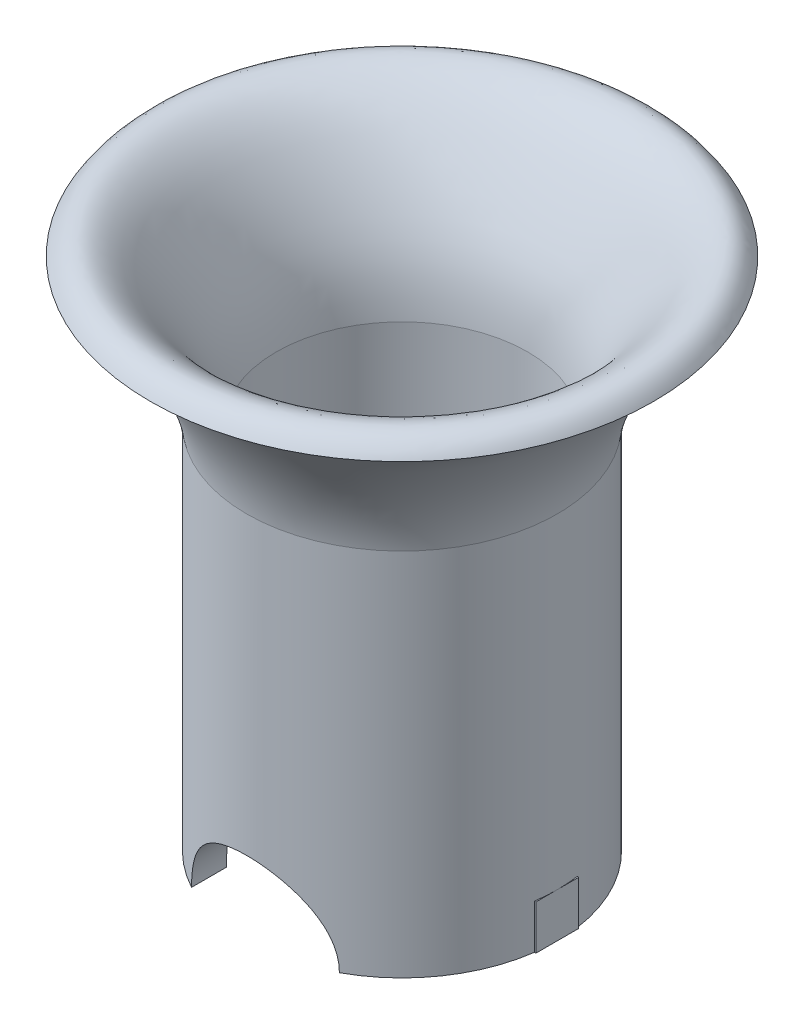
ISO-10303-21;
HEADER;
FILE_DESCRIPTION(('STEP AP214'),'2;1');
FILE_NAME('part.step','',(''),(''),'','','');
FILE_SCHEMA(('AUTOMOTIVE_DESIGN { 1 0 10303 214 1 1 1 1 }'));
ENDSEC;
DATA;
#1=APPLICATION_CONTEXT('core data for automotive mechanical design processes');
#2=APPLICATION_PROTOCOL_DEFINITION('international standard','automotive_design',2000,#1);
#3=PRODUCT_CONTEXT('',#1,'mechanical');
#4=PRODUCT('Part','Part','',(#3));
#5=PRODUCT_RELATED_PRODUCT_CATEGORY('part','',(#4));
#6=PRODUCT_DEFINITION_FORMATION('','',#4);
#7=PRODUCT_DEFINITION_CONTEXT('part definition',#1,'design');
#8=PRODUCT_DEFINITION('design','',#6,#7);
#9=PRODUCT_DEFINITION_SHAPE('','',#8);
#10=(LENGTH_UNIT() NAMED_UNIT(*) SI_UNIT(.MILLI.,.METRE.));
#11=(NAMED_UNIT(*) PLANE_ANGLE_UNIT() SI_UNIT($,.RADIAN.));
#12=(NAMED_UNIT(*) SI_UNIT($,.STERADIAN.) SOLID_ANGLE_UNIT());
#13=UNCERTAINTY_MEASURE_WITH_UNIT(LENGTH_MEASURE(1.E-05),#10,'distance_accuracy_value','');
#14=(GEOMETRIC_REPRESENTATION_CONTEXT(3) GLOBAL_UNCERTAINTY_ASSIGNED_CONTEXT((#13)) GLOBAL_UNIT_ASSIGNED_CONTEXT((#10,
#11,#12)) REPRESENTATION_CONTEXT('',''));
#15=CARTESIAN_POINT('',(0.,0.,0.));
#16=DIRECTION('',(0.,0.,1.));
#17=DIRECTION('',(1.,0.,0.));
#18=AXIS2_PLACEMENT_3D('',#15,#16,#17);
#19=CARTESIAN_POINT('',(-8.5,0.,0.));
#20=DIRECTION('',(0.,1.,0.));
#21=DIRECTION('',(0.,0.,1.));
#22=AXIS2_PLACEMENT_3D('',#19,#20,#21);
#23=PLANE('',#22);
#24=DIRECTION('',(0.,0.,-1.));
#25=VECTOR('',#24,1.);
#26=CARTESIAN_POINT('',(5.,0.,21.45));
#27=LINE('',#26,#25);
#28=CARTESIAN_POINT('',(5.,0.,6.87386354243376));
#29=VERTEX_POINT('',#28);
#30=CARTESIAN_POINT('',(5.,0.,9.23309265630969));
#31=VERTEX_POINT('',#30);
#32=EDGE_CURVE('E142',#29,#31,#27,.F.);
#33=ORIENTED_EDGE('',*,*,#32,.F.);
#34=CARTESIAN_POINT('',(0.,0.,0.));
#35=DIRECTION('',(0.,-1.,0.));
#36=DIRECTION('',(0.,0.,-1.));
#37=AXIS2_PLACEMENT_3D('',#34,#35,#36);
#38=CIRCLE('',#37,8.5);
#39=CARTESIAN_POINT('',(8.37541043770394,0.,1.45));
#40=VERTEX_POINT('',#39);
#41=EDGE_CURVE('E188',#40,#29,#38,.T.);
#42=ORIENTED_EDGE('',*,*,#41,.F.);
#43=DIRECTION('',(1.,0.,0.));
#44=VECTOR('',#43,1.);
#45=CARTESIAN_POINT('',(-2.5,0.,1.45));
#46=LINE('',#45,#44);
#47=CARTESIAN_POINT('',(-2.5,0.,1.45));
#48=VERTEX_POINT('',#47);
#49=EDGE_CURVE('E301',#48,#40,#46,.T.);
#50=ORIENTED_EDGE('',*,*,#49,.F.);
#51=DIRECTION('',(0.,0.,1.));
#52=VECTOR('',#51,1.);
#53=CARTESIAN_POINT('',(-2.5,0.,-1.45));
#54=LINE('',#53,#52);
#55=CARTESIAN_POINT('',(-2.5,0.,-1.45));
#56=VERTEX_POINT('',#55);
#57=EDGE_CURVE('E325',#56,#48,#54,.T.);
#58=ORIENTED_EDGE('',*,*,#57,.F.);
#59=DIRECTION('',(1.,0.,0.));
#60=VECTOR('',#59,1.);
#61=CARTESIAN_POINT('',(-2.5,0.,-1.45));
#62=LINE('',#61,#60);
#63=CARTESIAN_POINT('',(8.37541043770394,0.,-1.45));
#64=VERTEX_POINT('',#63);
#65=EDGE_CURVE('E314',#56,#64,#62,.T.);
#66=ORIENTED_EDGE('',*,*,#65,.T.);
#67=CARTESIAN_POINT('',(-5.,0.,6.87386354243376));
#68=VERTEX_POINT('',#67);
#69=EDGE_CURVE('E154',#68,#64,#38,.T.);
#70=ORIENTED_EDGE('',*,*,#69,.F.);
#71=DIRECTION('',(0.,0.,-1.));
#72=VECTOR('',#71,1.);
#73=CARTESIAN_POINT('',(-5.,0.,21.45));
#74=LINE('',#73,#72);
#75=CARTESIAN_POINT('',(-5.,0.,9.23309265630969));
#76=VERTEX_POINT('',#75);
#77=EDGE_CURVE('E139',#76,#68,#74,.T.);
#78=ORIENTED_EDGE('',*,*,#77,.F.);
#79=CARTESIAN_POINT('',(0.,0.,0.));
#80=DIRECTION('',(0.,-1.,0.));
#81=DIRECTION('',(0.,0.,-1.));
#82=AXIS2_PLACEMENT_3D('',#79,#80,#81);
#83=CIRCLE('',#82,10.5);
#84=CARTESIAN_POINT('',(10.3993990210973,0.,-1.45));
#85=VERTEX_POINT('',#84);
#86=EDGE_CURVE('E151',#76,#85,#83,.T.);
#87=ORIENTED_EDGE('',*,*,#86,.T.);
#88=CARTESIAN_POINT('',(10.5,0.,-1.45));
#89=VERTEX_POINT('',#88);
#90=EDGE_CURVE('E313',#85,#89,#62,.T.);
#91=ORIENTED_EDGE('',*,*,#90,.T.);
#92=DIRECTION('',(0.,0.,1.));
#93=VECTOR('',#92,1.);
#94=CARTESIAN_POINT('',(10.5,0.,-1.45));
#95=LINE('',#94,#93);
#96=CARTESIAN_POINT('',(10.5,0.,1.45));
#97=VERTEX_POINT('',#96);
#98=EDGE_CURVE('E331',#89,#97,#95,.T.);
#99=ORIENTED_EDGE('',*,*,#98,.T.);
#100=CARTESIAN_POINT('',(10.3993990210973,0.,1.45));
#101=VERTEX_POINT('',#100);
#102=EDGE_CURVE('E300',#101,#97,#46,.T.);
#103=ORIENTED_EDGE('',*,*,#102,.F.);
#104=EDGE_CURVE('E162',#101,#31,#83,.T.);
#105=ORIENTED_EDGE('',*,*,#104,.T.);
#106=EDGE_LOOP('',(#33,#42,#50,#58,#66,#70,#78,#87,#91,#99,#103,#105));
#107=FACE_BOUND('',#106,.T.);
#108=ADVANCED_FACE('F39',(#107),#23,.F.);
#109=CARTESIAN_POINT('',(0.,0.,0.));
#110=DIRECTION('',(0.,-1.,0.));
#111=DIRECTION('',(0.,0.,-1.));
#112=AXIS2_PLACEMENT_3D('',#109,#110,#111);
#113=CYLINDRICAL_SURFACE('',#112,8.5);
#114=CARTESIAN_POINT('',(0.,25.,0.));
#115=DIRECTION('',(0.,-1.,0.));
#116=DIRECTION('',(0.,0.,-1.));
#117=AXIS2_PLACEMENT_3D('',#114,#115,#116);
#118=CIRCLE('',#117,8.5);
#119=CARTESIAN_POINT('',(0.,25.,-8.5));
#120=VERTEX_POINT('',#119);
#121=EDGE_CURVE('E184',#120,#120,#118,.T.);
#122=ORIENTED_EDGE('',*,*,#121,.F.);
#123=EDGE_LOOP('',(#122));
#124=FACE_BOUND('',#123,.T.);
#125=CARTESIAN_POINT('',(-5.,0.,6.87386354243376));
#126=CARTESIAN_POINT('',(-5.00002762698772,0.127031840419532,6.87381207130144));
#127=CARTESIAN_POINT('',(-4.9951599952604,0.254033711125095,6.8773835892129));
#128=CARTESIAN_POINT('',(-4.97585356263384,0.506813697105629,6.89138136695817));
#129=CARTESIAN_POINT('',(-4.96142359531705,0.63259283321937,6.90180130022703));
#130=CARTESIAN_POINT('',(-4.92335834951799,0.881040729995309,6.92900078994346));
#131=CARTESIAN_POINT('',(-4.89979486908131,1.00372599076457,6.94573071689425));
#132=CARTESIAN_POINT('',(-4.84382795850321,1.24612160418095,6.98487638549004));
#133=CARTESIAN_POINT('',(-4.81142286355825,1.36583139193455,7.00729319787308));
#134=CARTESIAN_POINT('',(-4.70180131920097,1.71856070764222,7.08172813496281));
#135=CARTESIAN_POINT('',(-4.61200880508139,1.94625723085768,7.14106026135584));
#136=CARTESIAN_POINT('',(-4.40203778283476,2.38351932826443,7.27236972205275));
#137=CARTESIAN_POINT('',(-4.28179310605111,2.59304406919235,7.34437448709132));
#138=CARTESIAN_POINT('',(-3.99812131766827,3.01443243766363,7.50295977222075));
#139=CARTESIAN_POINT('',(-3.83130059471623,3.22374054574115,7.59026183860618));
#140=CARTESIAN_POINT('',(-3.46608288438449,3.6135245744319,7.76383189274972));
#141=CARTESIAN_POINT('',(-3.2676749270272,3.79399043458506,7.85009951001876));
#142=CARTESIAN_POINT('',(-2.93782398019796,4.04860047796028,7.9771584663809));
#143=CARTESIAN_POINT('',(-2.81620530774108,4.13415487726332,8.02100795967493));
#144=CARTESIAN_POINT('',(-2.56489327344668,4.29459224648281,8.10486498056056));
#145=CARTESIAN_POINT('',(-2.43520326535704,4.36947960671657,8.14487408654656));
#146=CARTESIAN_POINT('',(-2.16852325870026,4.50777797088069,8.21989606504622));
#147=CARTESIAN_POINT('',(-2.03153601661814,4.57119326907294,8.2549108060253));
#148=CARTESIAN_POINT('',(-1.75116652935802,4.68575879153627,8.31889869732371));
#149=CARTESIAN_POINT('',(-1.60778529011043,4.73691093708068,8.3478727939405));
#150=CARTESIAN_POINT('',(-1.32932398805587,4.82204233983721,8.39648672675625));
#151=CARTESIAN_POINT('',(-1.194702782298,4.85717238065777,8.41674205283343));
#152=CARTESIAN_POINT('',(-0.922236852218511,4.91618766519531,8.45093610945984));
#153=CARTESIAN_POINT('',(-0.784392591737924,4.94007451663044,8.46487574310987));
#154=CARTESIAN_POINT('',(-0.506771875309782,4.97621986867365,8.48602082180676));
#155=CARTESIAN_POINT('',(-0.366996835636269,4.98848647665224,8.4932309619269));
#156=CARTESIAN_POINT('',(-0.0867300957805486,5.00121481381228,8.50071301447176));
#157=CARTESIAN_POINT('',(0.0537615343354697,5.00167767580954,8.50098559270035));
#158=CARTESIAN_POINT('',(0.317330694271323,4.99144848591476,8.49497184462461));
#159=CARTESIAN_POINT('',(0.44048034758574,4.98208461452584,8.48946646039106));
#160=CARTESIAN_POINT('',(0.685445412854965,4.95432777543373,8.47320700764635));
#161=CARTESIAN_POINT('',(0.807260406901796,4.93593205787501,8.46245134062844));
#162=CARTESIAN_POINT('',(1.04863516110113,4.8903414803164,8.43594064350735));
#163=CARTESIAN_POINT('',(1.16819568735808,4.86314966855125,8.42018734534027));
#164=CARTESIAN_POINT('',(1.40436347908098,4.80028343532267,8.38403650938651));
#165=CARTESIAN_POINT('',(1.52096958682371,4.76460574376092,8.36363718134579));
#166=CARTESIAN_POINT('',(1.86685104764497,4.64484152886093,8.29579054863617));
#167=CARTESIAN_POINT('',(2.09069536138023,4.54831031972472,8.24186610553549));
#168=CARTESIAN_POINT('',(2.51920137812113,4.32574467934457,8.12116699229164));
#169=CARTESIAN_POINT('',(2.7238581612531,4.19970271006483,8.0543890397086));
#170=CARTESIAN_POINT('',(3.13393497702351,3.9050511792378,7.90452162421045));
#171=CARTESIAN_POINT('',(3.33665303215182,3.73318945542639,7.82043799066376));
#172=CARTESIAN_POINT('',(3.71218892088695,3.36003458563801,7.649333411729));
#173=CARTESIAN_POINT('',(3.88496063718,3.1586969109351,7.56230817826853));
#174=CARTESIAN_POINT('',(4.12779961844385,2.82541232897448,7.43108493226643));
#175=CARTESIAN_POINT('',(4.20937654569128,2.70241489674677,7.38504888630897));
#176=CARTESIAN_POINT('',(4.36180458071138,2.44878439018102,7.29605645681489));
#177=CARTESIAN_POINT('',(4.43265285856894,2.31814931379903,7.25310088738855));
#178=CARTESIAN_POINT('',(4.56272457618434,2.05028117844991,7.17198784064126));
#179=CARTESIAN_POINT('',(4.62198081507813,1.91306814444188,7.13381693873717));
#180=CARTESIAN_POINT('',(4.72834559703922,1.6325483082685,7.0637672215));
#181=CARTESIAN_POINT('',(4.77546405746663,1.48924659320664,7.03188327434154));
#182=CARTESIAN_POINT('',(4.84618085274268,1.2357328554754,6.98325557983875));
#183=CARTESIAN_POINT('',(4.87270755197598,1.12667022442722,6.9647330783794));
#184=CARTESIAN_POINT('',(4.91845452427515,0.906343597270457,6.93250208613364));
#185=CARTESIAN_POINT('',(4.93767709434214,0.795080304824734,6.91879208201755));
#186=CARTESIAN_POINT('',(4.96866979445923,0.570310338517283,6.89657224912268));
#187=CARTESIAN_POINT('',(4.98039431293872,0.45679418570295,6.88809425803927));
#188=CARTESIAN_POINT('',(4.99607204101878,0.228858189874719,6.87672026901672));
#189=CARTESIAN_POINT('',(5.00001892021662,0.114437686768705,6.8738288181308));
#190=CARTESIAN_POINT('',(5.,0.,6.87386354243376));
#191=B_SPLINE_CURVE_WITH_KNOTS('',3,(#125,#126,#127,#128,#129,#130,#131,#132,#133,#134,#135,
#136,#137,#138,#139,#140,#141,#142,#143,#144,#145,#146,#147,#148,#149,#150,#151,#152,#153,#154,
#155,#156,#157,#158,#159,#160,#161,#162,#163,#164,#165,#166,#167,#168,#169,#170,#171,#172,#173,
#174,#175,#176,#177,#178,#179,#180,#181,#182,#183,#184,#185,#186,#187,#188,#189,#190),
.UNSPECIFIED.,.F.,.F.,(4,2,2,2,2,2,2,2,2,2,2,2,2,2,2,2,2,2,2,2,2,2,2,2,2,2,2,2,2,2,2,2,4),(0.,
0.380903495238091,0.761455605549836,1.13907497821548,1.51676550263966,2.26889429667796,
3.02267160653222,3.8640086110141,4.70563844463776,5.17019265491029,5.63455510903485,
6.0987433800991,6.56285887899416,6.98404598273538,7.4051728405799,7.82600566400551,
8.2467980995853,8.61723809306607,8.9877909415185,9.35821551438078,9.72878306510705,
10.4744577011814,11.2203230157125,12.0532918915107,12.8875323557496,13.3508515439256,
13.8142927305555,14.276403038666,14.7381345661316,15.0790896352698,15.4199373920082,
15.762839325508,16.1060202398318),.UNSPECIFIED.);
#192=EDGE_CURVE('E290',#68,#29,#191,.T.);
#193=ORIENTED_EDGE('',*,*,#192,.F.);
#194=ORIENTED_EDGE('',*,*,#69,.T.);
#195=DIRECTION('',(0.,-1.,0.));
#196=VECTOR('',#195,1.);
#197=CARTESIAN_POINT('',(8.37541043770394,0.,-1.45));
#198=LINE('',#197,#196);
#199=CARTESIAN_POINT('',(8.37541043770394,1.,-1.45));
#200=VERTEX_POINT('',#199);
#201=EDGE_CURVE('E163',#64,#200,#198,.F.);
#202=ORIENTED_EDGE('',*,*,#201,.T.);
#203=CARTESIAN_POINT('',(8.37541043770394,1.,-1.45));
#204=CARTESIAN_POINT('',(8.37540712785156,1.05588616018467,-1.45000013207821));
#205=CARTESIAN_POINT('',(8.37581658845697,1.11174506776608,-1.44765608122627));
#206=CARTESIAN_POINT('',(8.37742821059302,1.22305382494441,-1.43830800552214));
#207=CARTESIAN_POINT('',(8.37863028352758,1.27850371955933,-1.43130450149035));
#208=CARTESIAN_POINT('',(8.38336906206706,1.4434744762293,-1.4033893206369));
#209=CARTESIAN_POINT('',(8.38803862081904,1.5518757704346,-1.37557266914832));
#210=CARTESIAN_POINT('',(8.39971629290048,1.76238408647044,-1.30235282460614));
#211=CARTESIAN_POINT('',(8.40672485121208,1.86448990623823,-1.25694628490598));
#212=CARTESIAN_POINT('',(8.4220412340064,2.0596807515219,-1.14984245677581));
#213=CARTESIAN_POINT('',(8.43034917836708,2.15276494344133,-1.08814366490329));
#214=CARTESIAN_POINT('',(8.44709296261671,2.32821516515927,-0.949489019648536));
#215=CARTESIAN_POINT('',(8.45552926843926,2.41047127285023,-0.872394132433042));
#216=CARTESIAN_POINT('',(8.47109282578037,2.56095387358101,-0.705409556886442));
#217=CARTESIAN_POINT('',(8.47821992988429,2.62917878682731,-0.615518429733189));
#218=CARTESIAN_POINT('',(8.4898855153862,2.74968225219542,-0.425345437004533));
#219=CARTESIAN_POINT('',(8.49442157743555,2.80194587957802,-0.325053963136242));
#220=CARTESIAN_POINT('',(8.49982904021907,2.88884669718472,-0.117038829282557));
#221=CARTESIAN_POINT('',(8.50070290710421,2.92349573539114,-0.00932022048927763));
#222=CARTESIAN_POINT('',(8.4985353710512,2.96583709233387,0.174202011859179));
#223=CARTESIAN_POINT('',(8.49668448376131,2.97864393892322,0.24888122609699));
#224=CARTESIAN_POINT('',(8.49096345667099,2.99572840371594,0.399051895827531));
#225=CARTESIAN_POINT('',(8.487095460021,3.00001505129827,0.474542406116847));
#226=CARTESIAN_POINT('',(8.48218721792911,3.,0.55));
#227=B_SPLINE_CURVE_WITH_KNOTS('',3,(#203,#204,#205,#206,#207,#208,#209,#210,#211,#212,#213,
#214,#215,#216,#217,#218,#219,#220,#221,#222,#223,#224,#225,#226),.UNSPECIFIED.,.F.,.F.,(4,2,2,
2,2,2,2,2,2,2,2,4),(0.,0.16755399203882,0.335089258516089,0.66939174681235,1.00375787065744,
1.33815486046406,1.67572055188296,2.01332422955402,2.3512426267112,2.68893343036537,
2.91582919006973,3.14248436590163),.UNSPECIFIED.);
#228=CARTESIAN_POINT('',(8.5,2.92288845230295,0.));
#229=VERTEX_POINT('',#228);
#230=EDGE_CURVE('E54',#200,#229,#227,.T.);
#231=ORIENTED_EDGE('',*,*,#230,.T.);
#232=CARTESIAN_POINT('',(8.48218721792911,3.,-0.55));
#233=CARTESIAN_POINT('',(8.48575721211345,3.00000040919576,-0.494987733984868));
#234=CARTESIAN_POINT('',(8.48878390347708,2.99772868616317,-0.439966051832638));
#235=CARTESIAN_POINT('',(8.49375896866593,2.98865371087037,-0.330253135769894));
#236=CARTESIAN_POINT('',(8.49570742766478,2.98185081663798,-0.275561876095736));
#237=CARTESIAN_POINT('',(8.49994165385414,2.95470848026736,-0.112761658494893));
#238=CARTESIAN_POINT('',(8.50063371941819,2.92763520847682,-0.0056525040612901));
#239=CARTESIAN_POINT('',(8.4982254976703,2.85627107926777,0.202592448629819));
#240=CARTESIAN_POINT('',(8.49512392024889,2.81197436814533,0.303726202560941));
#241=CARTESIAN_POINT('',(8.48599584815896,2.70743882465234,0.497255327519393));
#242=CARTESIAN_POINT('',(8.47996914808099,2.64719887284253,0.589650084327895));
#243=CARTESIAN_POINT('',(8.4660458671537,2.51179245699269,0.764076679887654));
#244=CARTESIAN_POINT('',(8.45813134300994,2.43648395081279,0.845996715835352));
#245=CARTESIAN_POINT('',(8.44175561387438,2.2733624425007,0.996235859091661));
#246=CARTESIAN_POINT('',(8.43329427754602,2.18554643009896,1.0645516826588));
#247=CARTESIAN_POINT('',(8.41698313079807,1.9982776937478,1.18670411621792));
#248=CARTESIAN_POINT('',(8.40914531014729,1.8986608709669,1.24029082869867));
#249=CARTESIAN_POINT('',(8.39543389523494,1.69173565915526,1.32994607028834));
#250=CARTESIAN_POINT('',(8.3895591265297,1.5844319158495,1.36602507967177));
#251=CARTESIAN_POINT('',(8.381958984983,1.39722617236214,1.41178644154942));
#252=CARTESIAN_POINT('',(8.37952329078203,1.31845269623305,1.42609744421687));
#253=CARTESIAN_POINT('',(8.37623985872976,1.15979841963417,1.44520912245173));
#254=CARTESIAN_POINT('',(8.37539074404858,1.07991863992223,1.45001804411073));
#255=CARTESIAN_POINT('',(8.37541043770394,1.,1.45));
#256=B_SPLINE_CURVE_WITH_KNOTS('',3,(#232,#233,#234,#235,#236,#237,#238,#239,#240,#241,#242,
#243,#244,#245,#246,#247,#248,#249,#250,#251,#252,#253,#254,#255),.UNSPECIFIED.,.F.,.F.,(4,2,2,
2,2,2,2,2,2,2,2,4),(0.,0.165282932383183,0.330552806580901,0.660280217698306,0.99011979085911,
1.31998252953421,1.65311508362399,1.98632795098134,2.32488704221886,2.66324321805065,
2.90298501258622,3.14251866297158),.UNSPECIFIED.);
#257=CARTESIAN_POINT('',(8.37541043770394,1.,1.45));
#258=VERTEX_POINT('',#257);
#259=EDGE_CURVE('E11',#229,#258,#256,.T.);
#260=ORIENTED_EDGE('',*,*,#259,.T.);
#261=DIRECTION('',(0.,-1.,0.));
#262=VECTOR('',#261,1.);
#263=CARTESIAN_POINT('',(8.37541043770394,0.,1.45));
#264=LINE('',#263,#262);
#265=EDGE_CURVE('E169',#40,#258,#264,.F.);
#266=ORIENTED_EDGE('',*,*,#265,.F.);
#267=ORIENTED_EDGE('',*,*,#41,.T.);
#268=EDGE_LOOP('',(#193,#194,#202,#231,#260,#266,#267));
#269=FACE_BOUND('',#268,.T.);
#270=ADVANCED_FACE('F233',(#124,#269),#113,.F.);
#271=CARTESIAN_POINT('',(0.,0.,0.));
#272=DIRECTION('',(0.,-1.,0.));
#273=DIRECTION('',(0.,0.,-1.));
#274=AXIS2_PLACEMENT_3D('',#271,#272,#273);
#275=CYLINDRICAL_SURFACE('',#274,10.5);
#276=CARTESIAN_POINT('',(0.,25.,0.));
#277=DIRECTION('',(0.,-1.,0.));
#278=DIRECTION('',(0.,0.,-1.));
#279=AXIS2_PLACEMENT_3D('',#276,#277,#278);
#280=CIRCLE('',#279,10.5);
#281=CARTESIAN_POINT('',(0.,25.,-10.5));
#282=VERTEX_POINT('',#281);
#283=EDGE_CURVE('E167',#282,#282,#280,.T.);
#284=ORIENTED_EDGE('',*,*,#283,.T.);
#285=EDGE_LOOP('',(#284));
#286=FACE_BOUND('',#285,.T.);
#287=CARTESIAN_POINT('',(5.,0.,9.23309265630969));
#288=CARTESIAN_POINT('',(5.00002266665219,0.131875846554975,9.23305701955633));
#289=CARTESIAN_POINT('',(4.99478337953833,0.263732067385492,9.23591711874986));
#290=CARTESIAN_POINT('',(4.97395886127326,0.526317429381845,9.24716103427713));
#291=CARTESIAN_POINT('',(4.95837931858314,0.657047150233091,9.25554181351281));
#292=CARTESIAN_POINT('',(4.91716066410007,0.915756208858339,9.27750192996492));
#293=CARTESIAN_POINT('',(4.89157493482029,1.04374640179668,9.29105367117207));
#294=CARTESIAN_POINT('',(4.83066775791308,1.29676572759958,9.32286577239735));
#295=CARTESIAN_POINT('',(4.79534533857729,1.42179456357166,9.34112660236435));
#296=CARTESIAN_POINT('',(4.67545463501461,1.79075001677057,9.402032391421));
#297=CARTESIAN_POINT('',(4.57684757391474,2.02925518037278,9.45086611823788));
#298=CARTESIAN_POINT('',(4.34548149675414,2.48649996136152,9.55944802211715));
#299=CARTESIAN_POINT('',(4.21267478168544,2.70521139153384,9.61921140900188));
#300=CARTESIAN_POINT('',(3.90524096392073,3.13429160414727,9.74827639323725));
#301=CARTESIAN_POINT('',(3.72825123763248,3.34285422662951,9.81795639998096));
#302=CARTESIAN_POINT('',(3.34227512095297,3.7287549946723,9.95595714664444));
#303=CARTESIAN_POINT('',(3.13328066311199,3.90608524317135,10.0242775389253));
#304=CARTESIAN_POINT('',(2.79242458777491,4.15012263917438,10.122626159483));
#305=CARTESIAN_POINT('',(2.67041175841998,4.22968121729538,10.1555739897464));
#306=CARTESIAN_POINT('',(2.41931330949933,4.37814654309984,10.218298954764));
#307=CARTESIAN_POINT('',(2.29023049098676,4.44705746850821,10.2480773316543));
#308=CARTESIAN_POINT('',(2.02583778144848,4.57356084014004,10.3036027627615));
#309=CARTESIAN_POINT('',(1.89052925607892,4.63115575414575,10.3293506956833));
#310=CARTESIAN_POINT('',(1.61463123993215,4.73441149502708,10.3760556007251));
#311=CARTESIAN_POINT('',(1.47404225189894,4.78007345474178,10.3970130276017));
#312=CARTESIAN_POINT('',(1.19806662046493,4.85631216758396,10.4322913869928));
#313=CARTESIAN_POINT('',(1.06294272343973,4.88768133329996,10.4469571967825));
#314=CARTESIAN_POINT('',(0.790111209773847,4.93912848074371,10.4711256771785));
#315=CARTESIAN_POINT('',(0.652403819273956,4.95920744601463,10.4806287975287));
#316=CARTESIAN_POINT('',(0.375585221604627,4.98781414522409,10.4941951241119));
#317=CARTESIAN_POINT('',(0.236474624058944,4.99634669470981,10.4982605981609));
#318=CARTESIAN_POINT('',(-0.0420213325607296,5.00176252242296,10.5008390948693));
#319=CARTESIAN_POINT('',(-0.181406676419428,4.99864642858164,10.4993524168227));
#320=CARTESIAN_POINT('',(-0.448226657399854,4.98151805924015,10.4912093259808));
#321=CARTESIAN_POINT('',(-0.575732020496846,4.96838994160737,10.4849724570874));
#322=CARTESIAN_POINT('',(-0.829103765009306,4.93244014572416,10.4679852438775));
#323=CARTESIAN_POINT('',(-0.954969611343439,4.90961538066752,10.4572334623077));
#324=CARTESIAN_POINT('',(-1.2041277618888,4.85451789066821,10.431478765705));
#325=CARTESIAN_POINT('',(-1.32742095612086,4.82224849320445,10.4164773479394));
#326=CARTESIAN_POINT('',(-1.57071677732755,4.74858207143514,10.3825802678656));
#327=CARTESIAN_POINT('',(-1.69071812655938,4.70718155767682,10.3636831169852));
#328=CARTESIAN_POINT('',(-2.04805904574179,4.56850455575833,10.3011784249284));
#329=CARTESIAN_POINT('',(-2.27929864665653,4.45751821464648,10.2521287730839));
#330=CARTESIAN_POINT('',(-2.72034127459082,4.20294371133494,10.1440375535126));
#331=CARTESIAN_POINT('',(-2.93013607529327,4.0593431057144,10.0849921742801));
#332=CARTESIAN_POINT('',(-3.34208886583686,3.72908970729726,9.95645279395696));
#333=CARTESIAN_POINT('',(-3.54196280599537,3.53976542671151,9.88649658241087));
#334=CARTESIAN_POINT('',(-3.90837602316583,3.13050078131399,9.74746510220817));
#335=CARTESIAN_POINT('',(-4.07488982879279,2.91053723816318,9.67839054410866));
#336=CARTESIAN_POINT('',(-4.30046040383855,2.5548456985426,9.57931635906551));
#337=CARTESIAN_POINT('',(-4.37312344130152,2.42840465182421,9.54627091808354));
#338=CARTESIAN_POINT('',(-4.50740822530069,2.16900302408399,9.48360447105921));
#339=CARTESIAN_POINT('',(-4.56903482001326,2.03604533859832,9.45398196340236));
#340=CARTESIAN_POINT('',(-4.68054532180719,1.76464765918649,9.39927417925676));
#341=CARTESIAN_POINT('',(-4.7304483096783,1.62621700796861,9.37418154579339));
#342=CARTESIAN_POINT('',(-4.81802468295873,1.3447531206034,9.32947220204324));
#343=CARTESIAN_POINT('',(-4.85570342913734,1.20172193228621,9.30985309194991));
#344=CARTESIAN_POINT('',(-4.92436075665675,0.884217348010687,9.27375266603107));
#345=CARTESIAN_POINT('',(-4.9526532791492,0.708991575659532,9.25860240847273));
#346=CARTESIAN_POINT('',(-4.98102044003031,0.444237325064351,9.24335083146668));
#347=CARTESIAN_POINT('',(-4.98813092576464,0.35561002476346,9.23951254927314));
#348=CARTESIAN_POINT('',(-4.99762211373882,0.177996790568285,9.2343808202778));
#349=CARTESIAN_POINT('',(-5.00000108332662,0.0890107372491154,9.2330883057221));
#350=CARTESIAN_POINT('',(-5.,0.,9.23309265630969));
#351=B_SPLINE_CURVE_WITH_KNOTS('',3,(#287,#288,#289,#290,#291,#292,#293,#294,#295,#296,#297,
#298,#299,#300,#301,#302,#303,#304,#305,#306,#307,#308,#309,#310,#311,#312,#313,#314,#315,#316,
#317,#318,#319,#320,#321,#322,#323,#324,#325,#326,#327,#328,#329,#330,#331,#332,#333,#334,#335,
#336,#337,#338,#339,#340,#341,#342,#343,#344,#345,#346,#347,#348,#349,#350),.UNSPECIFIED.,.F.,
.F.,(4,2,2,2,2,2,2,2,2,2,2,2,2,2,2,2,2,2,2,2,2,2,2,2,2,2,2,2,2,2,2,4),(0.,0.395460223768048,
0.790703074034156,1.18386547275313,1.57706712275655,2.36133203787759,3.14669676535486,
3.99000737068363,4.83353090073993,5.28106293845174,5.72841893364449,6.17567726142595,
6.62289311389843,7.04080489108655,7.45868025634523,7.87638128877142,8.29405980494859,
8.67859825865374,9.06325921719351,9.4477848169828,9.83245761848802,10.6123008131332,
11.3924420450778,12.2410141050641,13.0902316245442,13.5383312189249,13.9862334831024,
14.4334016326141,14.8803734169182,15.4133881987554,15.6802330881528,15.9471756765255),.UNSPECIFIED.);
#352=EDGE_CURVE('E136',#31,#76,#351,.T.);
#353=ORIENTED_EDGE('',*,*,#352,.F.);
#354=ORIENTED_EDGE('',*,*,#104,.F.);
#355=DIRECTION('',(0.,-1.,0.));
#356=VECTOR('',#355,1.);
#357=CARTESIAN_POINT('',(10.3993990210973,0.,1.45));
#358=LINE('',#357,#356);
#359=CARTESIAN_POINT('',(10.3993990210973,3.,1.45));
#360=VERTEX_POINT('',#359);
#361=EDGE_CURVE('E192',#360,#101,#358,.T.);
#362=ORIENTED_EDGE('',*,*,#361,.F.);
#363=CARTESIAN_POINT('',(0.,3.,0.));
#364=DIRECTION('',(0.,1.,0.));
#365=DIRECTION('',(0.,0.,1.));
#366=AXIS2_PLACEMENT_3D('',#363,#364,#365);
#367=CIRCLE('',#366,10.5);
#368=CARTESIAN_POINT('',(10.5,3.,0.));
#369=VERTEX_POINT('',#368);
#370=EDGE_CURVE('E196',#360,#369,#367,.T.);
#371=ORIENTED_EDGE('',*,*,#370,.T.);
#372=CARTESIAN_POINT('',(10.3993990210973,3.,-1.45));
#373=VERTEX_POINT('',#372);
#374=EDGE_CURVE('E199',#369,#373,#367,.T.);
#375=ORIENTED_EDGE('',*,*,#374,.T.);
#376=DIRECTION('',(0.,-1.,0.));
#377=VECTOR('',#376,1.);
#378=CARTESIAN_POINT('',(10.3993990210973,0.,-1.45));
#379=LINE('',#378,#377);
#380=EDGE_CURVE('E159',#373,#85,#379,.T.);
#381=ORIENTED_EDGE('',*,*,#380,.T.);
#382=ORIENTED_EDGE('',*,*,#86,.F.);
#383=EDGE_LOOP('',(#353,#354,#362,#371,#375,#381,#382));
#384=FACE_BOUND('',#383,.T.);
#385=ADVANCED_FACE('F157',(#286,#384),#275,.T.);
#386=CARTESIAN_POINT('',(-8.5,25.,0.));
#387=CARTESIAN_POINT('',(-8.59701534710193,26.015040059533,0.));
#388=CARTESIAN_POINT('',(-8.90700079709907,27.9673235925638,0.));
#389=CARTESIAN_POINT('',(-10.2034630455312,30.7165112684697,0.));
#390=CARTESIAN_POINT('',(-11.7468604200594,33.1056097397111,0.));
#391=CARTESIAN_POINT('',(-13.7772227859409,35.5008160231478,0.));
#392=CARTESIAN_POINT('',(-16.044814471012,36.4741230760751,0.));
#393=CARTESIAN_POINT('',(-17.0154602273647,34.8471677159007,0.));
#394=B_SPLINE_CURVE_WITH_KNOTS('',3,(#386,#387,#388,#389,#390,#391,#392,#393),.UNSPECIFIED.,.F.,
.F.,(4,1,1,1,1,4),(0.,0.199432852808804,0.381102798985666,0.5890742743151,0.751073337758956,1.),.UNSPECIFIED.);
#395=CARTESIAN_POINT('',(0.,0.,0.));
#396=DIRECTION('',(0.,-1.,0.));
#397=AXIS1_PLACEMENT('',#395,#396);
#398=SURFACE_OF_REVOLUTION('',#394,#397);
#399=CARTESIAN_POINT('',(0.,34.8471677159007,0.));
#400=DIRECTION('',(0.,-1.,0.));
#401=DIRECTION('',(0.,0.,-1.));
#402=AXIS2_PLACEMENT_3D('',#399,#400,#401);
#403=CIRCLE('',#402,17.0154602273647);
#404=CARTESIAN_POINT('',(0.,34.8471677159007,-17.0154602273647));
#405=VERTEX_POINT('',#404);
#406=EDGE_CURVE('E180',#405,#405,#403,.T.);
#407=ORIENTED_EDGE('',*,*,#406,.F.);
#408=EDGE_LOOP('',(#407));
#409=FACE_BOUND('',#408,.T.);
#410=ORIENTED_EDGE('',*,*,#121,.T.);
#411=EDGE_LOOP('',(#410));
#412=FACE_BOUND('',#411,.T.);
#413=ADVANCED_FACE('F279',(#409,#412),#398,.T.);
#414=CARTESIAN_POINT('',(-17.0154602273647,34.8471677159007,0.));
#415=CARTESIAN_POINT('',(-15.0616936040592,34.1491495486493,0.));
#416=CARTESIAN_POINT('',(-12.5469173132051,30.7994653819185,0.));
#417=CARTESIAN_POINT('',(-10.772360993686,27.1394113696585,0.));
#418=CARTESIAN_POINT('',(-10.5,25.,0.));
#419=B_SPLINE_CURVE_WITH_KNOTS('',3,(#414,#415,#416,#417,#418),.UNSPECIFIED.,.F.,.F.,(4,1,4),
(0.,0.483303415659432,1.),.UNSPECIFIED.);
#420=CARTESIAN_POINT('',(0.,0.,0.));
#421=DIRECTION('',(0.,-1.,0.));
#422=AXIS1_PLACEMENT('',#420,#421);
#423=SURFACE_OF_REVOLUTION('',#419,#422);
#424=ORIENTED_EDGE('',*,*,#283,.F.);
#425=EDGE_LOOP('',(#424));
#426=FACE_BOUND('',#425,.T.);
#427=ORIENTED_EDGE('',*,*,#406,.T.);
#428=EDGE_LOOP('',(#427));
#429=FACE_BOUND('',#428,.T.);
#430=ADVANCED_FACE('F271',(#426,#429),#423,.T.);
#431=CARTESIAN_POINT('',(10.5,0.,-1.45));
#432=DIRECTION('',(1.,0.,0.));
#433=DIRECTION('',(0.,0.,-1.));
#434=AXIS2_PLACEMENT_3D('',#431,#432,#433);
#435=PLANE('',#434);
#436=DIRECTION('',(0.,1.,0.));
#437=VECTOR('',#436,1.);
#438=CARTESIAN_POINT('',(10.5,0.,1.45));
#439=LINE('',#438,#437);
#440=CARTESIAN_POINT('',(10.5,3.,1.45));
#441=VERTEX_POINT('',#440);
#442=EDGE_CURVE('E304',#97,#441,#439,.T.);
#443=ORIENTED_EDGE('',*,*,#442,.F.);
#444=ORIENTED_EDGE('',*,*,#98,.F.);
#445=DIRECTION('',(0.,1.,0.));
#446=VECTOR('',#445,1.);
#447=CARTESIAN_POINT('',(10.5,0.,-1.45));
#448=LINE('',#447,#446);
#449=CARTESIAN_POINT('',(10.5,3.,-1.45));
#450=VERTEX_POINT('',#449);
#451=EDGE_CURVE('E317',#89,#450,#448,.T.);
#452=ORIENTED_EDGE('',*,*,#451,.T.);
#453=DIRECTION('',(0.,0.,1.));
#454=VECTOR('',#453,1.);
#455=CARTESIAN_POINT('',(10.5,3.,-1.45));
#456=LINE('',#455,#454);
#457=EDGE_CURVE('E326',#450,#369,#456,.T.);
#458=ORIENTED_EDGE('',*,*,#457,.T.);
#459=EDGE_CURVE('E330',#369,#441,#456,.T.);
#460=ORIENTED_EDGE('',*,*,#459,.T.);
#461=EDGE_LOOP('',(#443,#444,#452,#458,#460));
#462=FACE_BOUND('',#461,.T.);
#463=ADVANCED_FACE('F267',(#462),#435,.T.);
#464=CARTESIAN_POINT('',(0.,0.,1.45));
#465=DIRECTION('',(0.,0.,-1.));
#466=DIRECTION('',(-1.,0.,0.));
#467=AXIS2_PLACEMENT_3D('',#464,#465,#466);
#468=PLANE('',#467);
#469=DIRECTION('',(-1.,0.,0.));
#470=VECTOR('',#469,1.);
#471=CARTESIAN_POINT('',(-2.5,3.,1.45));
#472=LINE('',#471,#470);
#473=EDGE_CURVE('E247',#441,#360,#472,.T.);
#474=ORIENTED_EDGE('',*,*,#473,.T.);
#475=ORIENTED_EDGE('',*,*,#361,.T.);
#476=ORIENTED_EDGE('',*,*,#102,.T.);
#477=ORIENTED_EDGE('',*,*,#442,.T.);
#478=EDGE_LOOP('',(#474,#475,#476,#477));
#479=FACE_BOUND('',#478,.T.);
#480=ADVANCED_FACE('F270',(#479),#468,.F.);
#481=CARTESIAN_POINT('',(-2.5,3.,-1.45));
#482=DIRECTION('',(0.,1.,0.));
#483=DIRECTION('',(0.,0.,1.));
#484=AXIS2_PLACEMENT_3D('',#481,#482,#483);
#485=PLANE('',#484);
#486=ORIENTED_EDGE('',*,*,#370,.F.);
#487=ORIENTED_EDGE('',*,*,#473,.F.);
#488=ORIENTED_EDGE('',*,*,#459,.F.);
#489=EDGE_LOOP('',(#486,#487,#488));
#490=FACE_BOUND('',#489,.T.);
#491=ADVANCED_FACE('F266',(#490),#485,.T.);
#492=CARTESIAN_POINT('',(0.,0.,-1.45));
#493=DIRECTION('',(0.,0.,-1.));
#494=DIRECTION('',(-1.,0.,0.));
#495=AXIS2_PLACEMENT_3D('',#492,#493,#494);
#496=PLANE('',#495);
#497=ORIENTED_EDGE('',*,*,#380,.F.);
#498=DIRECTION('',(-1.,0.,0.));
#499=VECTOR('',#498,1.);
#500=CARTESIAN_POINT('',(-2.5,3.,-1.45));
#501=LINE('',#500,#499);
#502=EDGE_CURVE('E321',#450,#373,#501,.T.);
#503=ORIENTED_EDGE('',*,*,#502,.F.);
#504=ORIENTED_EDGE('',*,*,#451,.F.);
#505=ORIENTED_EDGE('',*,*,#90,.F.);
#506=EDGE_LOOP('',(#497,#503,#504,#505));
#507=FACE_BOUND('',#506,.T.);
#508=ADVANCED_FACE('F262',(#507),#496,.T.);
#509=ORIENTED_EDGE('',*,*,#374,.F.);
#510=ORIENTED_EDGE('',*,*,#457,.F.);
#511=ORIENTED_EDGE('',*,*,#502,.T.);
#512=EDGE_LOOP('',(#509,#510,#511));
#513=FACE_BOUND('',#512,.T.);
#514=ADVANCED_FACE('F260',(#513),#485,.T.);
#515=DIRECTION('',(0.,-1.,0.));
#516=VECTOR('',#515,1.);
#517=CARTESIAN_POINT('',(-2.5,0.,-1.45));
#518=LINE('',#517,#516);
#519=CARTESIAN_POINT('',(-2.5,1.,-1.45));
#520=VERTEX_POINT('',#519);
#521=EDGE_CURVE('E246',#520,#56,#518,.T.);
#522=ORIENTED_EDGE('',*,*,#521,.F.);
#523=DIRECTION('',(-1.,0.,0.));
#524=VECTOR('',#523,1.);
#525=CARTESIAN_POINT('',(0.,1.,-1.45));
#526=LINE('',#525,#524);
#527=CARTESIAN_POINT('',(0.,1.,-1.45));
#528=VERTEX_POINT('',#527);
#529=EDGE_CURVE('E211',#520,#528,#526,.F.);
#530=ORIENTED_EDGE('',*,*,#529,.T.);
#531=DIRECTION('',(-1.,0.,0.));
#532=VECTOR('',#531,1.);
#533=CARTESIAN_POINT('',(0.,1.,-1.45));
#534=LINE('',#533,#532);
#535=EDGE_CURVE('E208',#528,#200,#534,.F.);
#536=ORIENTED_EDGE('',*,*,#535,.T.);
#537=ORIENTED_EDGE('',*,*,#201,.F.);
#538=ORIENTED_EDGE('',*,*,#65,.F.);
#539=EDGE_LOOP('',(#522,#530,#536,#537,#538));
#540=FACE_BOUND('',#539,.T.);
#541=ADVANCED_FACE('F256',(#540),#496,.T.);
#542=ORIENTED_EDGE('',*,*,#265,.T.);
#543=DIRECTION('',(-1.,0.,0.));
#544=VECTOR('',#543,1.);
#545=CARTESIAN_POINT('',(-2.5,1.,1.45));
#546=LINE('',#545,#544);
#547=CARTESIAN_POINT('',(0.,1.,1.45));
#548=VERTEX_POINT('',#547);
#549=EDGE_CURVE('E218',#258,#548,#546,.T.);
#550=ORIENTED_EDGE('',*,*,#549,.T.);
#551=DIRECTION('',(-1.,0.,0.));
#552=VECTOR('',#551,1.);
#553=CARTESIAN_POINT('',(-2.5,1.,1.45));
#554=LINE('',#553,#552);
#555=CARTESIAN_POINT('',(-2.5,1.,1.45));
#556=VERTEX_POINT('',#555);
#557=EDGE_CURVE('E215',#548,#556,#554,.T.);
#558=ORIENTED_EDGE('',*,*,#557,.T.);
#559=DIRECTION('',(0.,-1.,0.));
#560=VECTOR('',#559,1.);
#561=CARTESIAN_POINT('',(-2.5,0.,1.45));
#562=LINE('',#561,#560);
#563=EDGE_CURVE('E297',#556,#48,#562,.T.);
#564=ORIENTED_EDGE('',*,*,#563,.T.);
#565=ORIENTED_EDGE('',*,*,#49,.T.);
#566=EDGE_LOOP('',(#542,#550,#558,#564,#565));
#567=FACE_BOUND('',#566,.T.);
#568=ADVANCED_FACE('F254',(#567),#468,.F.);
#569=CARTESIAN_POINT('',(-2.5,0.,-1.45));
#570=DIRECTION('',(-1.,0.,0.));
#571=DIRECTION('',(0.,0.,1.));
#572=AXIS2_PLACEMENT_3D('',#569,#570,#571);
#573=PLANE('',#572);
#574=CARTESIAN_POINT('',(-2.5,1.,-0.55));
#575=DIRECTION('',(-1.,0.,0.));
#576=DIRECTION('',(0.,0.,1.));
#577=AXIS2_PLACEMENT_3D('',#574,#575,#576);
#578=CIRCLE('',#577,2.);
#579=CARTESIAN_POINT('',(-2.5,2.92288845230294,0.));
#580=VERTEX_POINT('',#579);
#581=EDGE_CURVE('E202',#556,#580,#578,.T.);
#582=ORIENTED_EDGE('',*,*,#581,.T.);
#583=CARTESIAN_POINT('',(-2.5,1.,0.55));
#584=DIRECTION('',(-1.,0.,0.));
#585=DIRECTION('',(0.,0.,1.));
#586=AXIS2_PLACEMENT_3D('',#583,#584,#585);
#587=CIRCLE('',#586,2.);
#588=EDGE_CURVE('E205',#580,#520,#587,.T.);
#589=ORIENTED_EDGE('',*,*,#588,.T.);
#590=ORIENTED_EDGE('',*,*,#521,.T.);
#591=ORIENTED_EDGE('',*,*,#57,.T.);
#592=ORIENTED_EDGE('',*,*,#563,.F.);
#593=EDGE_LOOP('',(#582,#589,#590,#591,#592));
#594=FACE_BOUND('',#593,.T.);
#595=ADVANCED_FACE('F253',(#594),#573,.T.);
#596=CARTESIAN_POINT('',(0.,1.5,-1.45));
#597=DIRECTION('',(0.,0.,1.));
#598=DIRECTION('',(1.,0.,0.));
#599=AXIS2_PLACEMENT_3D('',#596,#597,#598);
#600=CYLINDRICAL_SURFACE('',#599,0.5);
#601=CARTESIAN_POINT('',(0.,2.,-1.18205080756897));
#602=CARTESIAN_POINT('',(-0.0257432958149681,1.99999913009149,-1.18205164826024));
#603=CARTESIAN_POINT('',(-0.0514949292811089,1.9980013264069,-1.18320944154457));
#604=CARTESIAN_POINT('',(-0.1022036006277,1.99011646189258,-1.18772525365709));
#605=CARTESIAN_POINT('',(-0.127160020234512,1.98422644868007,-1.19108494268753));
#606=CARTESIAN_POINT('',(-0.175484017761281,1.96887721501655,-1.19967229418036));
#607=CARTESIAN_POINT('',(-0.198857530344913,1.9594323099423,-1.20489246017514));
#608=CARTESIAN_POINT('',(-0.243628109986515,1.93734327981543,-1.21678929175956));
#609=CARTESIAN_POINT('',(-0.265024745880841,1.92469845908813,-1.22346627402343));
#610=CARTESIAN_POINT('',(-0.306903280937255,1.89560715054006,-1.23834346404923));
#611=CARTESIAN_POINT('',(-0.327216936253415,1.87895683419588,-1.24661748513035));
#612=CARTESIAN_POINT('',(-0.364863178892645,1.84286386014956,-1.26383033981751));
#613=CARTESIAN_POINT('',(-0.38219443330282,1.82341996100874,-1.27276946813414));
#614=CARTESIAN_POINT('',(-0.415373643740487,1.77981598248024,-1.29187794873097));
#615=CARTESIAN_POINT('',(-0.430834839609758,1.75537138560559,-1.30207248688421));
#616=CARTESIAN_POINT('',(-0.457365014424625,1.70408592410899,-1.3221703034224));
#617=CARTESIAN_POINT('',(-0.468432730027528,1.67724437295818,-1.33207349727463));
#618=CARTESIAN_POINT('',(-0.486048720937376,1.62102693198771,-1.35137627851059));
#619=CARTESIAN_POINT('',(-0.492463802269091,1.59160153580822,-1.3607544170778));
#620=CARTESIAN_POINT('',(-0.499903249332928,1.53171770749121,-1.37827591344744));
#621=CARTESIAN_POINT('',(-0.500929661785582,1.50125967199472,-1.38641973892428));
#622=CARTESIAN_POINT('',(-0.497454581054739,1.44189452468451,-1.40079813039803));
#623=CARTESIAN_POINT('',(-0.493239300966577,1.41298958433563,-1.40711025760993));
#624=CARTESIAN_POINT('',(-0.479734605414796,1.35609532699034,-1.41825703727918));
#625=CARTESIAN_POINT('',(-0.470446972577157,1.3281056919799,-1.42309220786735));
#626=CARTESIAN_POINT('',(-0.447663962239799,1.27556734548419,-1.43109305310211));
#627=CARTESIAN_POINT('',(-0.434438043716738,1.25091346649997,-1.43433806098949));
#628=CARTESIAN_POINT('',(-0.403990533507964,1.20407504651897,-1.43970087359137));
#629=CARTESIAN_POINT('',(-0.386769289854385,1.1818902906862,-1.44181877643491));
#630=CARTESIAN_POINT('',(-0.349120361228114,1.14100808578781,-1.44512701047107));
#631=CARTESIAN_POINT('',(-0.32874766515936,1.12226105466432,-1.44633147501179));
#632=CARTESIAN_POINT('',(-0.285173543217104,1.08837163545438,-1.44811890903168));
#633=CARTESIAN_POINT('',(-0.261972004753443,1.07322939091215,-1.44870185376488));
#634=CARTESIAN_POINT('',(-0.213151412096446,1.04685140322124,-1.44949531923325));
#635=CARTESIAN_POINT('',(-0.187511325995366,1.03565447716369,-1.44970221836195));
#636=CARTESIAN_POINT('',(-0.134723864207645,1.017685878508,-1.44994211675627));
#637=CARTESIAN_POINT('',(-0.107576436171373,1.01091435970764,-1.44997510997835));
#638=CARTESIAN_POINT('',(-0.0523289585148846,1.00195327516471,-1.45000419377285));
#639=CARTESIAN_POINT('',(-0.0242233556059838,0.999797905851385,-1.45000001010448));
#640=CARTESIAN_POINT('',(0.0319513933181058,1.00023195587733,-1.44999998994118));
#641=CARTESIAN_POINT('',(0.0600205387247206,1.00282145342797,-1.45000415358385));
#642=CARTESIAN_POINT('',(0.115352274289139,1.0126764505403,-1.44996582310519));
#643=CARTESIAN_POINT('',(0.142614103091365,1.01994622569905,-1.44992328629628));
#644=CARTESIAN_POINT('',(0.195530205538633,1.03895950349658,-1.4496429546851));
#645=CARTESIAN_POINT('',(0.221184452806709,1.05070307951847,-1.44940515667992));
#646=CARTESIAN_POINT('',(0.270133672814317,1.07831672554645,-1.44851353824925));
#647=CARTESIAN_POINT('',(0.293430453481335,1.09418359958206,-1.44786003946814));
#648=CARTESIAN_POINT('',(0.337015777222158,1.1295834777643,-1.44587609303479));
#649=CARTESIAN_POINT('',(0.357304520266032,1.14911623801222,-1.44454569040825));
#650=CARTESIAN_POINT('',(0.394151553319354,1.191100605958,-1.44095961481671));
#651=CARTESIAN_POINT('',(0.4107363346985,1.21352954734943,-1.43871086088655));
#652=CARTESIAN_POINT('',(0.439903856118308,1.2607221613492,-1.43307530125233));
#653=CARTESIAN_POINT('',(0.452487070291101,1.28548555690489,-1.42968863047403));
#654=CARTESIAN_POINT('',(0.47323964565361,1.33632121603819,-1.42168535971066));
#655=CARTESIAN_POINT('',(0.481450756121455,1.36237840258004,-1.41708104562876));
#656=CARTESIAN_POINT('',(0.493507578110474,1.41523399304399,-1.40660586367818));
#657=CARTESIAN_POINT('',(0.497353070110332,1.44203243417002,-1.40073493213642));
#658=CARTESIAN_POINT('',(0.500724816930132,1.49599431942559,-1.38772311231309));
#659=CARTESIAN_POINT('',(0.500188548084059,1.52315750560253,-1.3805652711118));
#660=CARTESIAN_POINT('',(0.494807368468319,1.57675809061969,-1.36523577439237));
#661=CARTESIAN_POINT('',(0.489961443636734,1.60319531713227,-1.35706388065713));
#662=CARTESIAN_POINT('',(0.475839254694552,1.65609406153687,-1.339538848467));
#663=CARTESIAN_POINT('',(0.4663434629772,1.68248378250647,-1.33014619447539));
#664=CARTESIAN_POINT('',(0.443165401522629,1.73320074443734,-1.31095488957957));
#665=CARTESIAN_POINT('',(0.429481457781694,1.75752715571964,-1.30115607769056));
#666=CARTESIAN_POINT('',(0.397335689258495,1.80494599869143,-1.28105518157893));
#667=CARTESIAN_POINT('',(0.378641199298525,1.82788300562394,-1.27075718768454));
#668=CARTESIAN_POINT('',(0.337301967695055,1.87027555929712,-1.25088021704426));
#669=CARTESIAN_POINT('',(0.314655643270799,1.88972970474009,-1.24130153060098));
#670=CARTESIAN_POINT('',(0.266076163065139,1.92436527275331,-1.2236752475246));
#671=CARTESIAN_POINT('',(0.240172333065627,1.93958134093976,-1.215615421364));
#672=CARTESIAN_POINT('',(0.185583327722645,1.96525683960429,-1.20171190367518));
#673=CARTESIAN_POINT('',(0.156903903130263,1.97572585989339,-1.19586374821636));
#674=CARTESIAN_POINT('',(0.106702993607302,1.98894827048576,-1.18839565410287));
#675=CARTESIAN_POINT('',(0.0856460489552099,1.99307839557128,-1.18603145452434));
#676=CARTESIAN_POINT('',(0.0430612557496171,1.99860423006785,-1.18285890388041));
#677=CARTESIAN_POINT('',(0.0215335447408565,2.00000072765406,-1.18205010435432));
#678=CARTESIAN_POINT('',(0.,2.,-1.18205080756897));
#679=B_SPLINE_CURVE_WITH_KNOTS('',3,(#601,#602,#603,#604,#605,#606,#607,#608,#609,#610,#611,
#612,#613,#614,#615,#616,#617,#618,#619,#620,#621,#622,#623,#624,#625,#626,#627,#628,#629,#630,
#631,#632,#633,#634,#635,#636,#637,#638,#639,#640,#641,#642,#643,#644,#645,#646,#647,#648,#649,
#650,#651,#652,#653,#654,#655,#656,#657,#658,#659,#660,#661,#662,#663,#664,#665,#666,#667,#668,
#669,#670,#671,#672,#673,#674,#675,#676,#677,#678),.UNSPECIFIED.,.T.,.F.,(4,2,2,2,2,2,2,2,2,2,2,
2,2,2,2,2,2,2,2,2,2,2,2,2,2,2,2,2,2,2,2,2,2,2,2,2,2,2,4),(0.,0.0771445160116195,
0.154347616224079,0.231243093013932,0.308155301577067,0.390438937676907,0.472759253508802,
0.56434886663184,0.655964797250372,0.750109800416764,0.84421904290403,0.933407914298984,
1.02256546133758,1.10665047618254,1.19072816914364,1.27347680645874,1.35622873831065,
1.43977349493715,1.5233211548704,1.60748562510657,1.69165148266874,1.77589433799439,
1.86013857520288,1.94431770841565,2.02849124300756,2.11204196635344,2.19558278636569,
2.27831087887956,2.36104313111918,2.44495793547469,2.52889249020671,2.61723984610493,
2.70562256064582,2.79917535833213,2.89276571195847,2.98556688372863,3.07817973750515,
3.14272757446428,3.20725679787794),.UNSPECIFIED.);
#680=EDGE_CURVE('E60',#528,#528,#679,.T.);
#681=ORIENTED_EDGE('',*,*,#680,.F.);
#682=EDGE_LOOP('',(#681));
#683=FACE_BOUND('',#682,.T.);
#684=CARTESIAN_POINT('',(0.,2.,1.18205080756897));
#685=CARTESIAN_POINT('',(-0.0257432958149681,1.99999913009149,1.18205164826024));
#686=CARTESIAN_POINT('',(-0.0514949292811089,1.9980013264069,1.18320944154457));
#687=CARTESIAN_POINT('',(-0.1022036006277,1.99011646189258,1.18772525365709));
#688=CARTESIAN_POINT('',(-0.127160020234512,1.98422644868007,1.19108494268753));
#689=CARTESIAN_POINT('',(-0.175484017761281,1.96887721501655,1.19967229418036));
#690=CARTESIAN_POINT('',(-0.198857530344913,1.9594323099423,1.20489246017514));
#691=CARTESIAN_POINT('',(-0.243628109986515,1.93734327981543,1.21678929175956));
#692=CARTESIAN_POINT('',(-0.265024745880841,1.92469845908813,1.22346627402343));
#693=CARTESIAN_POINT('',(-0.306903280937255,1.89560715054006,1.23834346404923));
#694=CARTESIAN_POINT('',(-0.327216936253415,1.87895683419588,1.24661748513035));
#695=CARTESIAN_POINT('',(-0.364863178892645,1.84286386014956,1.26383033981751));
#696=CARTESIAN_POINT('',(-0.38219443330282,1.82341996100874,1.27276946813414));
#697=CARTESIAN_POINT('',(-0.415373643740487,1.77981598248024,1.29187794873097));
#698=CARTESIAN_POINT('',(-0.430834839609758,1.75537138560559,1.30207248688421));
#699=CARTESIAN_POINT('',(-0.457365014424625,1.70408592410899,1.3221703034224));
#700=CARTESIAN_POINT('',(-0.468432730027528,1.67724437295818,1.33207349727463));
#701=CARTESIAN_POINT('',(-0.486048720937376,1.62102693198771,1.35137627851059));
#702=CARTESIAN_POINT('',(-0.492463802269091,1.59160153580822,1.3607544170778));
#703=CARTESIAN_POINT('',(-0.499903249332928,1.53171770749121,1.37827591344744));
#704=CARTESIAN_POINT('',(-0.500929661785582,1.50125967199472,1.38641973892428));
#705=CARTESIAN_POINT('',(-0.497454581054739,1.44189452468451,1.40079813039803));
#706=CARTESIAN_POINT('',(-0.493239300966577,1.41298958433563,1.40711025760993));
#707=CARTESIAN_POINT('',(-0.479734605414796,1.35609532699034,1.41825703727918));
#708=CARTESIAN_POINT('',(-0.470446972577157,1.3281056919799,1.42309220786735));
#709=CARTESIAN_POINT('',(-0.447663962239799,1.27556734548419,1.43109305310211));
#710=CARTESIAN_POINT('',(-0.434438043716738,1.25091346649997,1.43433806098949));
#711=CARTESIAN_POINT('',(-0.403990533507964,1.20407504651897,1.43970087359137));
#712=CARTESIAN_POINT('',(-0.386769289854385,1.1818902906862,1.44181877643491));
#713=CARTESIAN_POINT('',(-0.349120361228114,1.14100808578781,1.44512701047107));
#714=CARTESIAN_POINT('',(-0.32874766515936,1.12226105466432,1.44633147501179));
#715=CARTESIAN_POINT('',(-0.285173543217104,1.08837163545438,1.44811890903168));
#716=CARTESIAN_POINT('',(-0.261972004753443,1.07322939091215,1.44870185376488));
#717=CARTESIAN_POINT('',(-0.213151412096446,1.04685140322124,1.44949531923325));
#718=CARTESIAN_POINT('',(-0.187511325995366,1.03565447716369,1.44970221836195));
#719=CARTESIAN_POINT('',(-0.134723864207645,1.017685878508,1.44994211675627));
#720=CARTESIAN_POINT('',(-0.107576436171373,1.01091435970764,1.44997510997835));
#721=CARTESIAN_POINT('',(-0.0523289585148846,1.00195327516471,1.45000419377285));
#722=CARTESIAN_POINT('',(-0.0242233556059838,0.999797905851385,1.45000001010448));
#723=CARTESIAN_POINT('',(0.0319513933181058,1.00023195587733,1.44999998994118));
#724=CARTESIAN_POINT('',(0.0600205387247206,1.00282145342797,1.45000415358385));
#725=CARTESIAN_POINT('',(0.115352274289139,1.0126764505403,1.44996582310519));
#726=CARTESIAN_POINT('',(0.142614103091365,1.01994622569905,1.44992328629628));
#727=CARTESIAN_POINT('',(0.195530205538633,1.03895950349658,1.4496429546851));
#728=CARTESIAN_POINT('',(0.221184452806709,1.05070307951847,1.44940515667992));
#729=CARTESIAN_POINT('',(0.270133672814317,1.07831672554645,1.44851353824925));
#730=CARTESIAN_POINT('',(0.293430453481335,1.09418359958206,1.44786003946814));
#731=CARTESIAN_POINT('',(0.337015777222158,1.1295834777643,1.44587609303479));
#732=CARTESIAN_POINT('',(0.357304520266032,1.14911623801222,1.44454569040825));
#733=CARTESIAN_POINT('',(0.394151553319354,1.191100605958,1.44095961481671));
#734=CARTESIAN_POINT('',(0.4107363346985,1.21352954734943,1.43871086088655));
#735=CARTESIAN_POINT('',(0.439903856118308,1.2607221613492,1.43307530125233));
#736=CARTESIAN_POINT('',(0.452487070291101,1.28548555690489,1.42968863047403));
#737=CARTESIAN_POINT('',(0.47323964565361,1.33632121603819,1.42168535971066));
#738=CARTESIAN_POINT('',(0.481450756121455,1.36237840258004,1.41708104562876));
#739=CARTESIAN_POINT('',(0.493507578110474,1.41523399304399,1.40660586367818));
#740=CARTESIAN_POINT('',(0.497353070110332,1.44203243417002,1.40073493213642));
#741=CARTESIAN_POINT('',(0.500724816930132,1.49599431942559,1.38772311231309));
#742=CARTESIAN_POINT('',(0.500188548084059,1.52315750560253,1.3805652711118));
#743=CARTESIAN_POINT('',(0.494807368468319,1.57675809061969,1.36523577439237));
#744=CARTESIAN_POINT('',(0.489961443636734,1.60319531713227,1.35706388065713));
#745=CARTESIAN_POINT('',(0.475839254694552,1.65609406153687,1.339538848467));
#746=CARTESIAN_POINT('',(0.4663434629772,1.68248378250647,1.33014619447539));
#747=CARTESIAN_POINT('',(0.443165401522629,1.73320074443734,1.31095488957957));
#748=CARTESIAN_POINT('',(0.429481457781694,1.75752715571964,1.30115607769056));
#749=CARTESIAN_POINT('',(0.397335689258495,1.80494599869143,1.28105518157893));
#750=CARTESIAN_POINT('',(0.378641199298525,1.82788300562394,1.27075718768454));
#751=CARTESIAN_POINT('',(0.337301967695055,1.87027555929712,1.25088021704426));
#752=CARTESIAN_POINT('',(0.314655643270799,1.88972970474009,1.24130153060098));
#753=CARTESIAN_POINT('',(0.266076163065139,1.92436527275331,1.2236752475246));
#754=CARTESIAN_POINT('',(0.240172333065627,1.93958134093976,1.215615421364));
#755=CARTESIAN_POINT('',(0.185583327722645,1.96525683960429,1.20171190367518));
#756=CARTESIAN_POINT('',(0.156903903130263,1.97572585989339,1.19586374821636));
#757=CARTESIAN_POINT('',(0.106702993607302,1.98894827048576,1.18839565410287));
#758=CARTESIAN_POINT('',(0.0856460489552099,1.99307839557128,1.18603145452434));
#759=CARTESIAN_POINT('',(0.0430612557496171,1.99860423006785,1.18285890388041));
#760=CARTESIAN_POINT('',(0.0215335447408565,2.00000072765406,1.18205010435432));
#761=CARTESIAN_POINT('',(0.,2.,1.18205080756897));
#762=B_SPLINE_CURVE_WITH_KNOTS('',3,(#684,#685,#686,#687,#688,#689,#690,#691,#692,#693,#694,
#695,#696,#697,#698,#699,#700,#701,#702,#703,#704,#705,#706,#707,#708,#709,#710,#711,#712,#713,
#714,#715,#716,#717,#718,#719,#720,#721,#722,#723,#724,#725,#726,#727,#728,#729,#730,#731,#732,
#733,#734,#735,#736,#737,#738,#739,#740,#741,#742,#743,#744,#745,#746,#747,#748,#749,#750,#751,
#752,#753,#754,#755,#756,#757,#758,#759,#760,#761),.UNSPECIFIED.,.T.,.F.,(4,2,2,2,2,2,2,2,2,2,2,
2,2,2,2,2,2,2,2,2,2,2,2,2,2,2,2,2,2,2,2,2,2,2,2,2,2,2,4),(0.,0.0771445160116195,
0.154347616224079,0.231243093013932,0.308155301577067,0.390438937676907,0.472759253508802,
0.56434886663184,0.655964797250372,0.750109800416764,0.84421904290403,0.933407914298984,
1.02256546133758,1.10665047618254,1.19072816914364,1.27347680645874,1.35622873831065,
1.43977349493715,1.5233211548704,1.60748562510657,1.69165148266874,1.77589433799439,
1.86013857520288,1.94431770841565,2.02849124300756,2.11204196635344,2.19558278636569,
2.27831087887956,2.36104313111918,2.44495793547469,2.52889249020671,2.61723984610493,
2.70562256064582,2.79917535833213,2.89276571195847,2.98556688372863,3.07817973750515,
3.14272757446428,3.20725679787794),.UNSPECIFIED.);
#763=EDGE_CURVE('E44',#548,#548,#762,.T.);
#764=ORIENTED_EDGE('',*,*,#763,.T.);
#765=EDGE_LOOP('',(#764));
#766=FACE_BOUND('',#765,.T.);
#767=ADVANCED_FACE('F248',(#683,#766),#600,.F.);
#768=CARTESIAN_POINT('',(0.,0.,21.45));
#769=DIRECTION('',(0.,0.,-1.));
#770=DIRECTION('',(-1.,0.,0.));
#771=AXIS2_PLACEMENT_3D('',#768,#769,#770);
#772=CYLINDRICAL_SURFACE('',#771,5.);
#773=ORIENTED_EDGE('',*,*,#192,.T.);
#774=ORIENTED_EDGE('',*,*,#32,.T.);
#775=ORIENTED_EDGE('',*,*,#352,.T.);
#776=ORIENTED_EDGE('',*,*,#77,.T.);
#777=EDGE_LOOP('',(#773,#774,#775,#776));
#778=FACE_BOUND('',#777,.T.);
#779=ADVANCED_FACE('F138',(#778),#772,.F.);
#780=CARTESIAN_POINT('',(0.,1.,-0.55));
#781=DIRECTION('',(1.,0.,0.));
#782=DIRECTION('',(0.,0.,-1.));
#783=AXIS2_PLACEMENT_3D('',#780,#781,#782);
#784=CYLINDRICAL_SURFACE('',#783,2.);
#785=ORIENTED_EDGE('',*,*,#549,.F.);
#786=ORIENTED_EDGE('',*,*,#259,.F.);
#787=DIRECTION('',(1.,0.,0.));
#788=VECTOR('',#787,1.);
#789=CARTESIAN_POINT('',(2.99109360896456,2.92288845230294,0.));
#790=LINE('',#789,#788);
#791=EDGE_CURVE('E147',#580,#229,#790,.T.);
#792=ORIENTED_EDGE('',*,*,#791,.F.);
#793=ORIENTED_EDGE('',*,*,#581,.F.);
#794=ORIENTED_EDGE('',*,*,#557,.F.);
#795=ORIENTED_EDGE('',*,*,#763,.F.);
#796=EDGE_LOOP('',(#785,#786,#792,#793,#794,#795));
#797=FACE_BOUND('',#796,.T.);
#798=ADVANCED_FACE('F41',(#797),#784,.T.);
#799=CARTESIAN_POINT('',(-2.5,1.,0.55));
#800=DIRECTION('',(-1.,0.,0.));
#801=DIRECTION('',(0.,0.,1.));
#802=AXIS2_PLACEMENT_3D('',#799,#800,#801);
#803=CYLINDRICAL_SURFACE('',#802,2.);
#804=ORIENTED_EDGE('',*,*,#535,.F.);
#805=ORIENTED_EDGE('',*,*,#680,.T.);
#806=ORIENTED_EDGE('',*,*,#529,.F.);
#807=ORIENTED_EDGE('',*,*,#588,.F.);
#808=ORIENTED_EDGE('',*,*,#791,.T.);
#809=ORIENTED_EDGE('',*,*,#230,.F.);
#810=EDGE_LOOP('',(#804,#805,#806,#807,#808,#809));
#811=FACE_BOUND('',#810,.T.);
#812=ADVANCED_FACE('F237',(#811),#803,.T.);
#813=CLOSED_SHELL('',(#108,#270,#385,#413,#430,#463,#480,#491,#508,#514,#541,#568,#595,#767,
#779,#798,#812));
#814=MANIFOLD_SOLID_BREP('B2',#813);
#815=ADVANCED_BREP_SHAPE_REPRESENTATION('',(#18,#814),#14);
#816=SHAPE_DEFINITION_REPRESENTATION(#9,#815);
ENDSEC;
END-ISO-10303-21;
